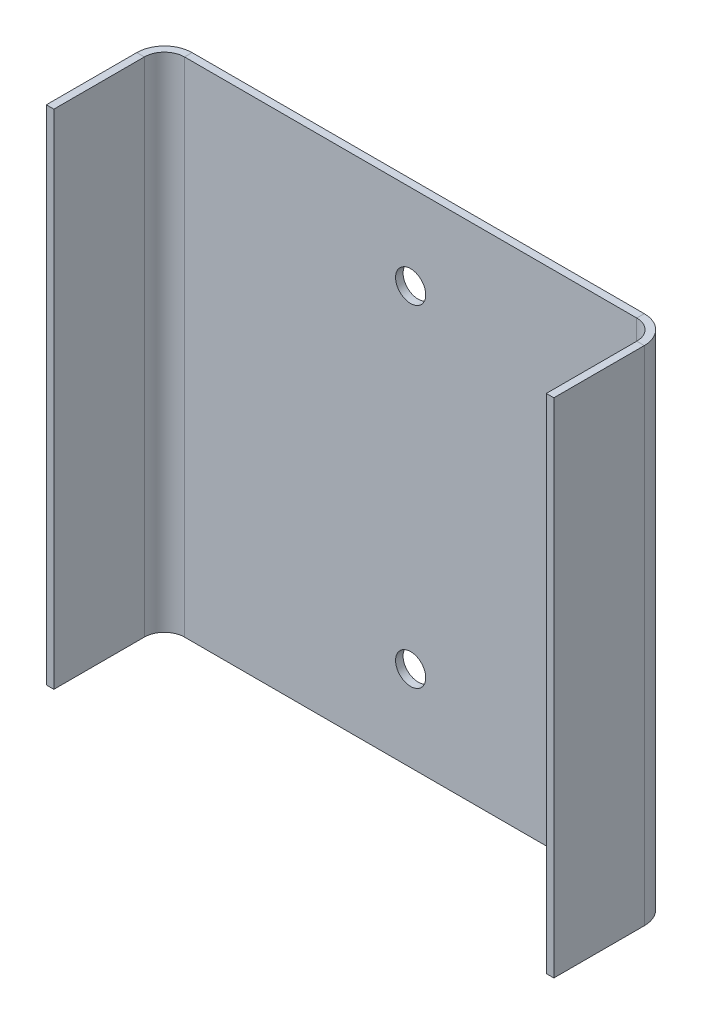
ISO-10303-21;
HEADER;
FILE_DESCRIPTION(('STEP AP214'),'2;1');
FILE_NAME('part.step','',(''),(''),'','','');
FILE_SCHEMA(('AUTOMOTIVE_DESIGN { 1 0 10303 214 1 1 1 1 }'));
ENDSEC;
DATA;
#1=APPLICATION_CONTEXT('core data for automotive mechanical design processes');
#2=APPLICATION_PROTOCOL_DEFINITION('international standard','automotive_design',2000,#1);
#3=PRODUCT_CONTEXT('',#1,'mechanical');
#4=PRODUCT('Part','Part','',(#3));
#5=PRODUCT_RELATED_PRODUCT_CATEGORY('part','',(#4));
#6=PRODUCT_DEFINITION_FORMATION('','',#4);
#7=PRODUCT_DEFINITION_CONTEXT('part definition',#1,'design');
#8=PRODUCT_DEFINITION('design','',#6,#7);
#9=PRODUCT_DEFINITION_SHAPE('','',#8);
#10=(LENGTH_UNIT() NAMED_UNIT(*) SI_UNIT(.MILLI.,.METRE.));
#11=(NAMED_UNIT(*) PLANE_ANGLE_UNIT() SI_UNIT($,.RADIAN.));
#12=(NAMED_UNIT(*) SI_UNIT($,.STERADIAN.) SOLID_ANGLE_UNIT());
#13=UNCERTAINTY_MEASURE_WITH_UNIT(LENGTH_MEASURE(1.E-05),#10,'distance_accuracy_value','');
#14=(GEOMETRIC_REPRESENTATION_CONTEXT(3) GLOBAL_UNCERTAINTY_ASSIGNED_CONTEXT((#13)) GLOBAL_UNIT_ASSIGNED_CONTEXT((#10,
#11,#12)) REPRESENTATION_CONTEXT('',''));
#15=CARTESIAN_POINT('',(0.,0.,0.));
#16=DIRECTION('',(0.,0.,1.));
#17=DIRECTION('',(1.,0.,0.));
#18=AXIS2_PLACEMENT_3D('',#15,#16,#17);
#19=CARTESIAN_POINT('',(-45.,50.,0.));
#20=DIRECTION('',(0.,1.,0.));
#21=DIRECTION('',(-1.,0.,0.));
#22=AXIS2_PLACEMENT_3D('',#19,#20,#21);
#23=PLANE('',#22);
#24=DIRECTION('',(0.,0.,-1.));
#25=VECTOR('',#24,1.);
#26=CARTESIAN_POINT('',(-45.,50.,0.));
#27=LINE('',#26,#25);
#28=CARTESIAN_POINT('',(-45.,50.,1.5));
#29=VERTEX_POINT('',#28);
#30=CARTESIAN_POINT('',(-45.,50.,0.));
#31=VERTEX_POINT('',#30);
#32=EDGE_CURVE('E88',#29,#31,#27,.T.);
#33=ORIENTED_EDGE('',*,*,#32,.F.);
#34=DIRECTION('',(1.,0.,0.));
#35=VECTOR('',#34,1.);
#36=CARTESIAN_POINT('',(0.,50.,1.5));
#37=LINE('',#36,#35);
#38=CARTESIAN_POINT('',(45.,50.,1.5));
#39=VERTEX_POINT('',#38);
#40=EDGE_CURVE('E196',#39,#29,#37,.F.);
#41=ORIENTED_EDGE('',*,*,#40,.F.);
#42=DIRECTION('',(0.,0.,-1.));
#43=VECTOR('',#42,1.);
#44=CARTESIAN_POINT('',(45.,50.,0.));
#45=LINE('',#44,#43);
#46=CARTESIAN_POINT('',(45.,50.,0.));
#47=VERTEX_POINT('',#46);
#48=EDGE_CURVE('E206',#39,#47,#45,.T.);
#49=ORIENTED_EDGE('',*,*,#48,.T.);
#50=DIRECTION('',(-1.,0.,0.));
#51=VECTOR('',#50,1.);
#52=CARTESIAN_POINT('',(-45.,50.,0.));
#53=LINE('',#52,#51);
#54=EDGE_CURVE('E199',#47,#31,#53,.T.);
#55=ORIENTED_EDGE('',*,*,#54,.T.);
#56=EDGE_LOOP('',(#33,#41,#49,#55));
#57=FACE_BOUND('',#56,.T.);
#58=ADVANCED_FACE('F78',(#57),#23,.T.);
#59=CARTESIAN_POINT('',(-45.,-50.,0.));
#60=DIRECTION('',(0.,-1.,0.));
#61=DIRECTION('',(1.,0.,0.));
#62=AXIS2_PLACEMENT_3D('',#59,#60,#61);
#63=PLANE('',#62);
#64=DIRECTION('',(1.,0.,0.));
#65=VECTOR('',#64,1.);
#66=CARTESIAN_POINT('',(0.,-50.,1.5));
#67=LINE('',#66,#65);
#68=CARTESIAN_POINT('',(-45.,-50.,1.5));
#69=VERTEX_POINT('',#68);
#70=CARTESIAN_POINT('',(45.,-50.,1.5));
#71=VERTEX_POINT('',#70);
#72=EDGE_CURVE('E202',#69,#71,#67,.T.);
#73=ORIENTED_EDGE('',*,*,#72,.F.);
#74=DIRECTION('',(0.,0.,-1.));
#75=VECTOR('',#74,1.);
#76=CARTESIAN_POINT('',(-45.,-50.,0.));
#77=LINE('',#76,#75);
#78=CARTESIAN_POINT('',(-45.,-50.,0.));
#79=VERTEX_POINT('',#78);
#80=EDGE_CURVE('E13',#69,#79,#77,.T.);
#81=ORIENTED_EDGE('',*,*,#80,.T.);
#82=DIRECTION('',(1.,0.,0.));
#83=VECTOR('',#82,1.);
#84=CARTESIAN_POINT('',(-45.,-50.,0.));
#85=LINE('',#84,#83);
#86=CARTESIAN_POINT('',(45.,-50.,0.));
#87=VERTEX_POINT('',#86);
#88=EDGE_CURVE('E124',#79,#87,#85,.T.);
#89=ORIENTED_EDGE('',*,*,#88,.T.);
#90=DIRECTION('',(0.,0.,-1.));
#91=VECTOR('',#90,1.);
#92=CARTESIAN_POINT('',(45.,-50.,0.));
#93=LINE('',#92,#91);
#94=EDGE_CURVE('E121',#71,#87,#93,.T.);
#95=ORIENTED_EDGE('',*,*,#94,.F.);
#96=EDGE_LOOP('',(#73,#81,#89,#95));
#97=FACE_BOUND('',#96,.T.);
#98=ADVANCED_FACE('F80',(#97),#63,.T.);
#99=CARTESIAN_POINT('',(0.,0.,0.));
#100=DIRECTION('',(0.,0.,1.));
#101=DIRECTION('',(1.,0.,0.));
#102=AXIS2_PLACEMENT_3D('',#99,#100,#101);
#103=PLANE('',#102);
#104=CARTESIAN_POINT('',(0.,32.9999999999999,0.));
#105=DIRECTION('',(0.,0.,-1.));
#106=DIRECTION('',(-1.,0.,0.));
#107=AXIS2_PLACEMENT_3D('',#104,#105,#106);
#108=CIRCLE('',#107,3.);
#109=CARTESIAN_POINT('',(-3.00000000000001,32.9999999999999,0.));
#110=VERTEX_POINT('',#109);
#111=EDGE_CURVE('E213',#110,#110,#108,.T.);
#112=ORIENTED_EDGE('',*,*,#111,.F.);
#113=EDGE_LOOP('',(#112));
#114=FACE_BOUND('',#113,.T.);
#115=CARTESIAN_POINT('',(0.,-33.0000000000001,0.));
#116=DIRECTION('',(0.,0.,-1.));
#117=DIRECTION('',(-1.,0.,0.));
#118=AXIS2_PLACEMENT_3D('',#115,#116,#117);
#119=CIRCLE('',#118,3.);
#120=CARTESIAN_POINT('',(-3.00000000000001,-33.0000000000001,0.));
#121=VERTEX_POINT('',#120);
#122=EDGE_CURVE('E219',#121,#121,#119,.T.);
#123=ORIENTED_EDGE('',*,*,#122,.F.);
#124=EDGE_LOOP('',(#123));
#125=FACE_BOUND('',#124,.T.);
#126=DIRECTION('',(0.,1.,0.));
#127=VECTOR('',#126,1.);
#128=CARTESIAN_POINT('',(45.,50.,0.));
#129=LINE('',#128,#127);
#130=EDGE_CURVE('E193',#87,#47,#129,.T.);
#131=ORIENTED_EDGE('',*,*,#130,.F.);
#132=ORIENTED_EDGE('',*,*,#88,.F.);
#133=DIRECTION('',(0.,-1.,0.));
#134=VECTOR('',#133,1.);
#135=CARTESIAN_POINT('',(-45.,50.,0.));
#136=LINE('',#135,#134);
#137=EDGE_CURVE('E97',#31,#79,#136,.T.);
#138=ORIENTED_EDGE('',*,*,#137,.F.);
#139=ORIENTED_EDGE('',*,*,#54,.F.);
#140=EDGE_LOOP('',(#131,#132,#138,#139));
#141=FACE_BOUND('',#140,.T.);
#142=ADVANCED_FACE('F328',(#114,#125,#141),#103,.F.);
#143=CARTESIAN_POINT('',(0.,0.,1.5));
#144=DIRECTION('',(0.,0.,1.));
#145=DIRECTION('',(1.,0.,0.));
#146=AXIS2_PLACEMENT_3D('',#143,#144,#145);
#147=PLANE('',#146);
#148=CARTESIAN_POINT('',(0.,32.9999999999999,1.5));
#149=DIRECTION('',(0.,0.,1.));
#150=DIRECTION('',(1.,0.,0.));
#151=AXIS2_PLACEMENT_3D('',#148,#149,#150);
#152=CIRCLE('',#151,3.);
#153=CARTESIAN_POINT('',(3.,32.9999999999999,1.5));
#154=VERTEX_POINT('',#153);
#155=EDGE_CURVE('E82',#154,#154,#152,.T.);
#156=ORIENTED_EDGE('',*,*,#155,.F.);
#157=EDGE_LOOP('',(#156));
#158=FACE_BOUND('',#157,.T.);
#159=CARTESIAN_POINT('',(0.,-33.0000000000001,1.5));
#160=DIRECTION('',(0.,0.,1.));
#161=DIRECTION('',(1.,0.,0.));
#162=AXIS2_PLACEMENT_3D('',#159,#160,#161);
#163=CIRCLE('',#162,3.);
#164=CARTESIAN_POINT('',(3.,-33.0000000000001,1.5));
#165=VERTEX_POINT('',#164);
#166=EDGE_CURVE('E211',#165,#165,#163,.T.);
#167=ORIENTED_EDGE('',*,*,#166,.F.);
#168=EDGE_LOOP('',(#167));
#169=FACE_BOUND('',#168,.T.);
#170=DIRECTION('',(0.,1.,0.));
#171=VECTOR('',#170,1.);
#172=CARTESIAN_POINT('',(45.,0.,1.5));
#173=LINE('',#172,#171);
#174=EDGE_CURVE('E189',#71,#39,#173,.T.);
#175=ORIENTED_EDGE('',*,*,#174,.T.);
#176=ORIENTED_EDGE('',*,*,#40,.T.);
#177=DIRECTION('',(0.,1.,0.));
#178=VECTOR('',#177,1.);
#179=CARTESIAN_POINT('',(-45.,0.,1.5));
#180=LINE('',#179,#178);
#181=EDGE_CURVE('E114',#29,#69,#180,.F.);
#182=ORIENTED_EDGE('',*,*,#181,.T.);
#183=ORIENTED_EDGE('',*,*,#72,.T.);
#184=EDGE_LOOP('',(#175,#176,#182,#183));
#185=FACE_BOUND('',#184,.T.);
#186=ADVANCED_FACE('F330',(#158,#169,#185),#147,.T.);
#187=CARTESIAN_POINT('',(-45.,50.,5.50000000000001));
#188=DIRECTION('',(0.,1.,0.));
#189=DIRECTION('',(0.,0.,1.));
#190=AXIS2_PLACEMENT_3D('',#187,#188,#189);
#191=PLANE('',#190);
#192=DIRECTION('',(1.,0.,0.));
#193=VECTOR('',#192,1.);
#194=CARTESIAN_POINT('',(-50.5,50.,5.49999999999999));
#195=LINE('',#194,#193);
#196=CARTESIAN_POINT('',(-49.,50.,5.49999999999999));
#197=VERTEX_POINT('',#196);
#198=CARTESIAN_POINT('',(-50.5,50.,5.49999999999999));
#199=VERTEX_POINT('',#198);
#200=EDGE_CURVE('E149',#197,#199,#195,.F.);
#201=ORIENTED_EDGE('',*,*,#200,.F.);
#202=CARTESIAN_POINT('',(-45.,50.,5.50000000000001));
#203=DIRECTION('',(0.,-1.,0.));
#204=DIRECTION('',(0.,0.,-1.));
#205=AXIS2_PLACEMENT_3D('',#202,#203,#204);
#206=CIRCLE('',#205,4.);
#207=EDGE_CURVE('E143',#29,#197,#206,.F.);
#208=ORIENTED_EDGE('',*,*,#207,.F.);
#209=ORIENTED_EDGE('',*,*,#32,.T.);
#210=CARTESIAN_POINT('',(-45.,50.,5.50000000000001));
#211=DIRECTION('',(0.,-1.,0.));
#212=DIRECTION('',(0.,0.,-1.));
#213=AXIS2_PLACEMENT_3D('',#210,#211,#212);
#214=CIRCLE('',#213,5.5);
#215=EDGE_CURVE('E186',#31,#199,#214,.F.);
#216=ORIENTED_EDGE('',*,*,#215,.T.);
#217=EDGE_LOOP('',(#201,#208,#209,#216));
#218=FACE_BOUND('',#217,.T.);
#219=ADVANCED_FACE('F333',(#218),#191,.T.);
#220=CARTESIAN_POINT('',(-45.,-50.,5.50000000000001));
#221=DIRECTION('',(0.,1.,0.));
#222=DIRECTION('',(0.,0.,1.));
#223=AXIS2_PLACEMENT_3D('',#220,#221,#222);
#224=PLANE('',#223);
#225=CARTESIAN_POINT('',(-45.,-50.,5.50000000000001));
#226=DIRECTION('',(0.,-1.,0.));
#227=DIRECTION('',(0.,0.,-1.));
#228=AXIS2_PLACEMENT_3D('',#225,#226,#227);
#229=CIRCLE('',#228,4.);
#230=CARTESIAN_POINT('',(-49.,-50.,5.49999999999999));
#231=VERTEX_POINT('',#230);
#232=EDGE_CURVE('E141',#231,#69,#229,.T.);
#233=ORIENTED_EDGE('',*,*,#232,.F.);
#234=DIRECTION('',(1.,0.,0.));
#235=VECTOR('',#234,1.);
#236=CARTESIAN_POINT('',(-49.,-50.,5.5));
#237=LINE('',#236,#235);
#238=CARTESIAN_POINT('',(-50.5,-50.,5.49999999999999));
#239=VERTEX_POINT('',#238);
#240=EDGE_CURVE('E148',#231,#239,#237,.F.);
#241=ORIENTED_EDGE('',*,*,#240,.T.);
#242=CARTESIAN_POINT('',(-45.,-50.,5.50000000000001));
#243=DIRECTION('',(0.,-1.,0.));
#244=DIRECTION('',(0.,0.,-1.));
#245=AXIS2_PLACEMENT_3D('',#242,#243,#244);
#246=CIRCLE('',#245,5.5);
#247=EDGE_CURVE('E190',#239,#79,#246,.T.);
#248=ORIENTED_EDGE('',*,*,#247,.T.);
#249=ORIENTED_EDGE('',*,*,#80,.F.);
#250=EDGE_LOOP('',(#233,#241,#248,#249));
#251=FACE_BOUND('',#250,.T.);
#252=ADVANCED_FACE('F155',(#251),#224,.F.);
#253=CARTESIAN_POINT('',(-45.,-50.,5.50000000000001));
#254=DIRECTION('',(0.,-1.,0.));
#255=DIRECTION('',(-1.,0.,0.));
#256=AXIS2_PLACEMENT_3D('',#253,#254,#255);
#257=CYLINDRICAL_SURFACE('',#256,5.5);
#258=ORIENTED_EDGE('',*,*,#137,.T.);
#259=ORIENTED_EDGE('',*,*,#247,.F.);
#260=DIRECTION('',(0.,-1.,0.));
#261=VECTOR('',#260,1.);
#262=CARTESIAN_POINT('',(-50.5,50.,5.49999999999999));
#263=LINE('',#262,#261);
#264=EDGE_CURVE('E171',#239,#199,#263,.F.);
#265=ORIENTED_EDGE('',*,*,#264,.T.);
#266=ORIENTED_EDGE('',*,*,#215,.F.);
#267=EDGE_LOOP('',(#258,#259,#265,#266));
#268=FACE_BOUND('',#267,.T.);
#269=ADVANCED_FACE('F340',(#268),#257,.T.);
#270=CARTESIAN_POINT('',(-45.,-50.,5.50000000000001));
#271=DIRECTION('',(0.,-1.,0.));
#272=DIRECTION('',(-1.,0.,0.));
#273=AXIS2_PLACEMENT_3D('',#270,#271,#272);
#274=CYLINDRICAL_SURFACE('',#273,4.);
#275=ORIENTED_EDGE('',*,*,#181,.F.);
#276=ORIENTED_EDGE('',*,*,#207,.T.);
#277=DIRECTION('',(0.,-1.,0.));
#278=VECTOR('',#277,1.);
#279=CARTESIAN_POINT('',(-49.,50.,5.49999999999999));
#280=LINE('',#279,#278);
#281=EDGE_CURVE('E138',#197,#231,#280,.T.);
#282=ORIENTED_EDGE('',*,*,#281,.T.);
#283=ORIENTED_EDGE('',*,*,#232,.T.);
#284=EDGE_LOOP('',(#275,#276,#282,#283));
#285=FACE_BOUND('',#284,.T.);
#286=ADVANCED_FACE('F140',(#285),#274,.F.);
#287=CARTESIAN_POINT('',(-50.5000000000001,-50.,23.5));
#288=DIRECTION('',(0.,1.,0.));
#289=DIRECTION('',(0.,0.,1.));
#290=AXIS2_PLACEMENT_3D('',#287,#288,#289);
#291=PLANE('',#290);
#292=ORIENTED_EDGE('',*,*,#240,.F.);
#293=DIRECTION('',(0.,0.,-1.));
#294=VECTOR('',#293,1.);
#295=CARTESIAN_POINT('',(-49.0000000000001,-50.,23.5));
#296=LINE('',#295,#294);
#297=CARTESIAN_POINT('',(-49.0000000000001,-50.,23.5));
#298=VERTEX_POINT('',#297);
#299=EDGE_CURVE('E167',#231,#298,#296,.F.);
#300=ORIENTED_EDGE('',*,*,#299,.T.);
#301=DIRECTION('',(1.,0.,0.));
#302=VECTOR('',#301,1.);
#303=CARTESIAN_POINT('',(-50.5000000000001,-50.,23.5));
#304=LINE('',#303,#302);
#305=CARTESIAN_POINT('',(-50.5000000000001,-50.,23.5));
#306=VERTEX_POINT('',#305);
#307=EDGE_CURVE('E159',#306,#298,#304,.T.);
#308=ORIENTED_EDGE('',*,*,#307,.F.);
#309=DIRECTION('',(0.,0.,1.));
#310=VECTOR('',#309,1.);
#311=CARTESIAN_POINT('',(-50.5,-50.,-1.91325740340322E-13));
#312=LINE('',#311,#310);
#313=EDGE_CURVE('E170',#239,#306,#312,.T.);
#314=ORIENTED_EDGE('',*,*,#313,.F.);
#315=EDGE_LOOP('',(#292,#300,#308,#314));
#316=FACE_BOUND('',#315,.T.);
#317=ADVANCED_FACE('F164',(#316),#291,.F.);
#318=CARTESIAN_POINT('',(-50.5,50.,1.49999999999999));
#319=DIRECTION('',(0.,-1.,0.));
#320=DIRECTION('',(0.,0.,-1.));
#321=AXIS2_PLACEMENT_3D('',#318,#319,#320);
#322=PLANE('',#321);
#323=ORIENTED_EDGE('',*,*,#200,.T.);
#324=DIRECTION('',(0.,0.,-1.));
#325=VECTOR('',#324,1.);
#326=CARTESIAN_POINT('',(-50.5,50.,-1.5978531350438E-13));
#327=LINE('',#326,#325);
#328=CARTESIAN_POINT('',(-50.5000000000001,50.,23.5));
#329=VERTEX_POINT('',#328);
#330=EDGE_CURVE('E276',#329,#199,#327,.T.);
#331=ORIENTED_EDGE('',*,*,#330,.F.);
#332=DIRECTION('',(1.,0.,0.));
#333=VECTOR('',#332,1.);
#334=CARTESIAN_POINT('',(-50.5000000000001,50.,23.5));
#335=LINE('',#334,#333);
#336=CARTESIAN_POINT('',(-49.0000000000001,50.,23.5));
#337=VERTEX_POINT('',#336);
#338=EDGE_CURVE('E273',#329,#337,#335,.T.);
#339=ORIENTED_EDGE('',*,*,#338,.T.);
#340=DIRECTION('',(0.,0.,1.));
#341=VECTOR('',#340,1.);
#342=CARTESIAN_POINT('',(-49.,50.,1.5));
#343=LINE('',#342,#341);
#344=EDGE_CURVE('E178',#337,#197,#343,.F.);
#345=ORIENTED_EDGE('',*,*,#344,.T.);
#346=EDGE_LOOP('',(#323,#331,#339,#345));
#347=FACE_BOUND('',#346,.T.);
#348=ADVANCED_FACE('F283',(#347),#322,.F.);
#349=CARTESIAN_POINT('',(-50.5,0.,-1.75555526922351E-13));
#350=DIRECTION('',(1.,0.,0.));
#351=DIRECTION('',(0.,0.,-1.));
#352=AXIS2_PLACEMENT_3D('',#349,#350,#351);
#353=PLANE('',#352);
#354=ORIENTED_EDGE('',*,*,#264,.F.);
#355=ORIENTED_EDGE('',*,*,#313,.T.);
#356=DIRECTION('',(0.,1.,0.));
#357=VECTOR('',#356,1.);
#358=CARTESIAN_POINT('',(-50.5000000000001,0.,23.5));
#359=LINE('',#358,#357);
#360=EDGE_CURVE('E279',#306,#329,#359,.T.);
#361=ORIENTED_EDGE('',*,*,#360,.T.);
#362=ORIENTED_EDGE('',*,*,#330,.T.);
#363=EDGE_LOOP('',(#354,#355,#361,#362));
#364=FACE_BOUND('',#363,.T.);
#365=ADVANCED_FACE('F308',(#364),#353,.F.);
#366=CARTESIAN_POINT('',(-49.,0.,-1.70318304914087E-13));
#367=DIRECTION('',(1.,0.,0.));
#368=DIRECTION('',(0.,0.,-1.));
#369=AXIS2_PLACEMENT_3D('',#366,#367,#368);
#370=PLANE('',#369);
#371=ORIENTED_EDGE('',*,*,#299,.F.);
#372=ORIENTED_EDGE('',*,*,#281,.F.);
#373=ORIENTED_EDGE('',*,*,#344,.F.);
#374=DIRECTION('',(0.,-1.,0.));
#375=VECTOR('',#374,1.);
#376=CARTESIAN_POINT('',(-49.0000000000001,50.,23.5));
#377=LINE('',#376,#375);
#378=EDGE_CURVE('E176',#298,#337,#377,.F.);
#379=ORIENTED_EDGE('',*,*,#378,.F.);
#380=EDGE_LOOP('',(#371,#372,#373,#379));
#381=FACE_BOUND('',#380,.T.);
#382=ADVANCED_FACE('F174',(#381),#370,.T.);
#383=CARTESIAN_POINT('',(-50.5000000000001,50.,23.5));
#384=DIRECTION('',(0.,0.,-1.));
#385=DIRECTION('',(-1.,0.,0.));
#386=AXIS2_PLACEMENT_3D('',#383,#384,#385);
#387=PLANE('',#386);
#388=ORIENTED_EDGE('',*,*,#378,.T.);
#389=ORIENTED_EDGE('',*,*,#338,.F.);
#390=ORIENTED_EDGE('',*,*,#360,.F.);
#391=ORIENTED_EDGE('',*,*,#307,.T.);
#392=EDGE_LOOP('',(#388,#389,#390,#391));
#393=FACE_BOUND('',#392,.T.);
#394=ADVANCED_FACE('F309',(#393),#387,.F.);
#395=CARTESIAN_POINT('',(45.,-50.,5.49999999999999));
#396=DIRECTION('',(0.,-1.,0.));
#397=DIRECTION('',(0.,0.,-1.));
#398=AXIS2_PLACEMENT_3D('',#395,#396,#397);
#399=PLANE('',#398);
#400=DIRECTION('',(-1.,0.,0.));
#401=VECTOR('',#400,1.);
#402=CARTESIAN_POINT('',(50.5,-50.,5.49999999999998));
#403=LINE('',#402,#401);
#404=CARTESIAN_POINT('',(49.,-50.,5.49999999999998));
#405=VERTEX_POINT('',#404);
#406=CARTESIAN_POINT('',(50.5,-50.,5.49999999999998));
#407=VERTEX_POINT('',#406);
#408=EDGE_CURVE('E217',#405,#407,#403,.F.);
#409=ORIENTED_EDGE('',*,*,#408,.F.);
#410=CARTESIAN_POINT('',(45.,-50.,5.49999999999999));
#411=DIRECTION('',(0.,1.,0.));
#412=DIRECTION('',(0.,0.,1.));
#413=AXIS2_PLACEMENT_3D('',#410,#411,#412);
#414=CIRCLE('',#413,4.);
#415=EDGE_CURVE('E267',#71,#405,#414,.F.);
#416=ORIENTED_EDGE('',*,*,#415,.F.);
#417=ORIENTED_EDGE('',*,*,#94,.T.);
#418=CARTESIAN_POINT('',(45.,-50.,5.49999999999999));
#419=DIRECTION('',(0.,1.,0.));
#420=DIRECTION('',(0.,0.,1.));
#421=AXIS2_PLACEMENT_3D('',#418,#419,#420);
#422=CIRCLE('',#421,5.5);
#423=EDGE_CURVE('E185',#87,#407,#422,.F.);
#424=ORIENTED_EDGE('',*,*,#423,.T.);
#425=EDGE_LOOP('',(#409,#416,#417,#424));
#426=FACE_BOUND('',#425,.T.);
#427=ADVANCED_FACE('F311',(#426),#399,.T.);
#428=CARTESIAN_POINT('',(45.,50.,5.50000000000002));
#429=DIRECTION('',(0.,-1.,0.));
#430=DIRECTION('',(0.,0.,-1.));
#431=AXIS2_PLACEMENT_3D('',#428,#429,#430);
#432=PLANE('',#431);
#433=CARTESIAN_POINT('',(45.,50.,5.50000000000002));
#434=DIRECTION('',(0.,1.,0.));
#435=DIRECTION('',(0.,0.,1.));
#436=AXIS2_PLACEMENT_3D('',#433,#434,#435);
#437=CIRCLE('',#436,4.);
#438=CARTESIAN_POINT('',(49.,50.,5.5));
#439=VERTEX_POINT('',#438);
#440=EDGE_CURVE('E229',#439,#39,#437,.T.);
#441=ORIENTED_EDGE('',*,*,#440,.F.);
#442=DIRECTION('',(-1.,0.,0.));
#443=VECTOR('',#442,1.);
#444=CARTESIAN_POINT('',(49.,50.,5.5));
#445=LINE('',#444,#443);
#446=CARTESIAN_POINT('',(50.5,50.,5.49999999999999));
#447=VERTEX_POINT('',#446);
#448=EDGE_CURVE('E254',#439,#447,#445,.F.);
#449=ORIENTED_EDGE('',*,*,#448,.T.);
#450=CARTESIAN_POINT('',(45.,50.,5.50000000000002));
#451=DIRECTION('',(0.,1.,0.));
#452=DIRECTION('',(0.,0.,1.));
#453=AXIS2_PLACEMENT_3D('',#450,#451,#452);
#454=CIRCLE('',#453,5.5);
#455=EDGE_CURVE('E264',#447,#47,#454,.T.);
#456=ORIENTED_EDGE('',*,*,#455,.T.);
#457=ORIENTED_EDGE('',*,*,#48,.F.);
#458=EDGE_LOOP('',(#441,#449,#456,#457));
#459=FACE_BOUND('',#458,.T.);
#460=ADVANCED_FACE('F317',(#459),#432,.F.);
#461=CARTESIAN_POINT('',(45.,50.,5.50000000000002));
#462=DIRECTION('',(0.,1.,0.));
#463=DIRECTION('',(1.,0.,0.));
#464=AXIS2_PLACEMENT_3D('',#461,#462,#463);
#465=CYLINDRICAL_SURFACE('',#464,5.5);
#466=ORIENTED_EDGE('',*,*,#130,.T.);
#467=ORIENTED_EDGE('',*,*,#455,.F.);
#468=DIRECTION('',(0.,1.,0.));
#469=VECTOR('',#468,1.);
#470=CARTESIAN_POINT('',(50.5,-50.,5.49999999999998));
#471=LINE('',#470,#469);
#472=EDGE_CURVE('E251',#447,#407,#471,.F.);
#473=ORIENTED_EDGE('',*,*,#472,.T.);
#474=ORIENTED_EDGE('',*,*,#423,.F.);
#475=EDGE_LOOP('',(#466,#467,#473,#474));
#476=FACE_BOUND('',#475,.T.);
#477=ADVANCED_FACE('F357',(#476),#465,.T.);
#478=CARTESIAN_POINT('',(45.,50.,5.50000000000002));
#479=DIRECTION('',(0.,1.,0.));
#480=DIRECTION('',(1.,0.,0.));
#481=AXIS2_PLACEMENT_3D('',#478,#479,#480);
#482=CYLINDRICAL_SURFACE('',#481,4.);
#483=ORIENTED_EDGE('',*,*,#174,.F.);
#484=ORIENTED_EDGE('',*,*,#415,.T.);
#485=DIRECTION('',(0.,1.,0.));
#486=VECTOR('',#485,1.);
#487=CARTESIAN_POINT('',(49.,-50.,5.49999999999998));
#488=LINE('',#487,#486);
#489=EDGE_CURVE('E257',#405,#439,#488,.T.);
#490=ORIENTED_EDGE('',*,*,#489,.T.);
#491=ORIENTED_EDGE('',*,*,#440,.T.);
#492=EDGE_LOOP('',(#483,#484,#490,#491));
#493=FACE_BOUND('',#492,.T.);
#494=ADVANCED_FACE('F360',(#493),#482,.F.);
#495=CARTESIAN_POINT('',(50.5,-50.,1.49999999999999));
#496=DIRECTION('',(0.,1.,0.));
#497=DIRECTION('',(0.,0.,1.));
#498=AXIS2_PLACEMENT_3D('',#495,#496,#497);
#499=PLANE('',#498);
#500=ORIENTED_EDGE('',*,*,#408,.T.);
#501=DIRECTION('',(0.,0.,-1.));
#502=VECTOR('',#501,1.);
#503=CARTESIAN_POINT('',(50.5,-50.,-1.61362334846177E-13));
#504=LINE('',#503,#502);
#505=CARTESIAN_POINT('',(50.5000000000001,-50.,23.5));
#506=VERTEX_POINT('',#505);
#507=EDGE_CURVE('E239',#506,#407,#504,.T.);
#508=ORIENTED_EDGE('',*,*,#507,.F.);
#509=DIRECTION('',(-1.,0.,0.));
#510=VECTOR('',#509,1.);
#511=CARTESIAN_POINT('',(50.5,-50.,23.5));
#512=LINE('',#511,#510);
#513=CARTESIAN_POINT('',(49.0000000000001,-50.,23.5));
#514=VERTEX_POINT('',#513);
#515=EDGE_CURVE('E230',#506,#514,#512,.T.);
#516=ORIENTED_EDGE('',*,*,#515,.T.);
#517=DIRECTION('',(0.,0.,1.));
#518=VECTOR('',#517,1.);
#519=CARTESIAN_POINT('',(49.,-50.,1.5));
#520=LINE('',#519,#518);
#521=EDGE_CURVE('E248',#514,#405,#520,.F.);
#522=ORIENTED_EDGE('',*,*,#521,.T.);
#523=EDGE_LOOP('',(#500,#508,#516,#522));
#524=FACE_BOUND('',#523,.T.);
#525=ADVANCED_FACE('F363',(#524),#499,.F.);
#526=CARTESIAN_POINT('',(50.5000000000001,50.,23.5));
#527=DIRECTION('',(0.,-1.,0.));
#528=DIRECTION('',(0.,0.,-1.));
#529=AXIS2_PLACEMENT_3D('',#526,#527,#528);
#530=PLANE('',#529);
#531=ORIENTED_EDGE('',*,*,#448,.F.);
#532=DIRECTION('',(0.,0.,-1.));
#533=VECTOR('',#532,1.);
#534=CARTESIAN_POINT('',(49.0000000000001,50.,23.5));
#535=LINE('',#534,#533);
#536=CARTESIAN_POINT('',(49.0000000000001,50.,23.5));
#537=VERTEX_POINT('',#536);
#538=EDGE_CURVE('E245',#439,#537,#535,.F.);
#539=ORIENTED_EDGE('',*,*,#538,.T.);
#540=DIRECTION('',(-1.,0.,0.));
#541=VECTOR('',#540,1.);
#542=CARTESIAN_POINT('',(50.5000000000001,50.,23.5));
#543=LINE('',#542,#541);
#544=CARTESIAN_POINT('',(50.5000000000001,50.,23.5));
#545=VERTEX_POINT('',#544);
#546=EDGE_CURVE('E226',#545,#537,#543,.T.);
#547=ORIENTED_EDGE('',*,*,#546,.F.);
#548=DIRECTION('',(0.,0.,1.));
#549=VECTOR('',#548,1.);
#550=CARTESIAN_POINT('',(50.5,50.,-1.61362334846177E-13));
#551=LINE('',#550,#549);
#552=EDGE_CURVE('E236',#447,#545,#551,.T.);
#553=ORIENTED_EDGE('',*,*,#552,.F.);
#554=EDGE_LOOP('',(#531,#539,#547,#553));
#555=FACE_BOUND('',#554,.T.);
#556=ADVANCED_FACE('F370',(#555),#530,.F.);
#557=CARTESIAN_POINT('',(50.5,0.,-1.61362334846177E-13));
#558=DIRECTION('',(-1.,0.,0.));
#559=DIRECTION('',(0.,0.,1.));
#560=AXIS2_PLACEMENT_3D('',#557,#558,#559);
#561=PLANE('',#560);
#562=ORIENTED_EDGE('',*,*,#472,.F.);
#563=ORIENTED_EDGE('',*,*,#552,.T.);
#564=DIRECTION('',(0.,-1.,0.));
#565=VECTOR('',#564,1.);
#566=CARTESIAN_POINT('',(50.5000000000001,0.,23.5));
#567=LINE('',#566,#565);
#568=EDGE_CURVE('E233',#545,#506,#567,.T.);
#569=ORIENTED_EDGE('',*,*,#568,.T.);
#570=ORIENTED_EDGE('',*,*,#507,.T.);
#571=EDGE_LOOP('',(#562,#563,#569,#570));
#572=FACE_BOUND('',#571,.T.);
#573=ADVANCED_FACE('F374',(#572),#561,.F.);
#574=CARTESIAN_POINT('',(49.,0.,-1.56125112837913E-13));
#575=DIRECTION('',(-1.,0.,0.));
#576=DIRECTION('',(0.,0.,1.));
#577=AXIS2_PLACEMENT_3D('',#574,#575,#576);
#578=PLANE('',#577);
#579=ORIENTED_EDGE('',*,*,#538,.F.);
#580=ORIENTED_EDGE('',*,*,#489,.F.);
#581=ORIENTED_EDGE('',*,*,#521,.F.);
#582=DIRECTION('',(0.,1.,0.));
#583=VECTOR('',#582,1.);
#584=CARTESIAN_POINT('',(49.0000000000001,-50.,23.5));
#585=LINE('',#584,#583);
#586=EDGE_CURVE('E242',#537,#514,#585,.F.);
#587=ORIENTED_EDGE('',*,*,#586,.F.);
#588=EDGE_LOOP('',(#579,#580,#581,#587));
#589=FACE_BOUND('',#588,.T.);
#590=ADVANCED_FACE('F380',(#589),#578,.T.);
#591=CARTESIAN_POINT('',(50.5000000000001,-50.,23.5));
#592=DIRECTION('',(0.,0.,-1.));
#593=DIRECTION('',(-1.,0.,0.));
#594=AXIS2_PLACEMENT_3D('',#591,#592,#593);
#595=PLANE('',#594);
#596=ORIENTED_EDGE('',*,*,#586,.T.);
#597=ORIENTED_EDGE('',*,*,#515,.F.);
#598=ORIENTED_EDGE('',*,*,#568,.F.);
#599=ORIENTED_EDGE('',*,*,#546,.T.);
#600=EDGE_LOOP('',(#596,#597,#598,#599));
#601=FACE_BOUND('',#600,.T.);
#602=ADVANCED_FACE('F376',(#601),#595,.F.);
#603=CARTESIAN_POINT('',(0.,-33.0000000000001,23.5));
#604=DIRECTION('',(0.,0.,-1.));
#605=DIRECTION('',(-1.,0.,0.));
#606=AXIS2_PLACEMENT_3D('',#603,#604,#605);
#607=CYLINDRICAL_SURFACE('',#606,3.);
#608=ORIENTED_EDGE('',*,*,#166,.T.);
#609=EDGE_LOOP('',(#608));
#610=FACE_BOUND('',#609,.T.);
#611=ORIENTED_EDGE('',*,*,#122,.T.);
#612=EDGE_LOOP('',(#611));
#613=FACE_BOUND('',#612,.T.);
#614=ADVANCED_FACE('F379',(#610,#613),#607,.F.);
#615=CARTESIAN_POINT('',(0.,32.9999999999999,23.5));
#616=DIRECTION('',(0.,0.,-1.));
#617=DIRECTION('',(-1.,0.,0.));
#618=AXIS2_PLACEMENT_3D('',#615,#616,#617);
#619=CYLINDRICAL_SURFACE('',#618,3.);
#620=ORIENTED_EDGE('',*,*,#155,.T.);
#621=EDGE_LOOP('',(#620));
#622=FACE_BOUND('',#621,.T.);
#623=ORIENTED_EDGE('',*,*,#111,.T.);
#624=EDGE_LOOP('',(#623));
#625=FACE_BOUND('',#624,.T.);
#626=ADVANCED_FACE('F390',(#622,#625),#619,.F.);
#627=CLOSED_SHELL('',(#58,#98,#142,#186,#219,#252,#269,#286,#317,#348,#365,#382,#394,#427,#460,
#477,#494,#525,#556,#573,#590,#602,#614,#626));
#628=MANIFOLD_SOLID_BREP('B2',#627);
#629=ADVANCED_BREP_SHAPE_REPRESENTATION('',(#18,#628),#14);
#630=SHAPE_DEFINITION_REPRESENTATION(#9,#629);
ENDSEC;
END-ISO-10303-21;
